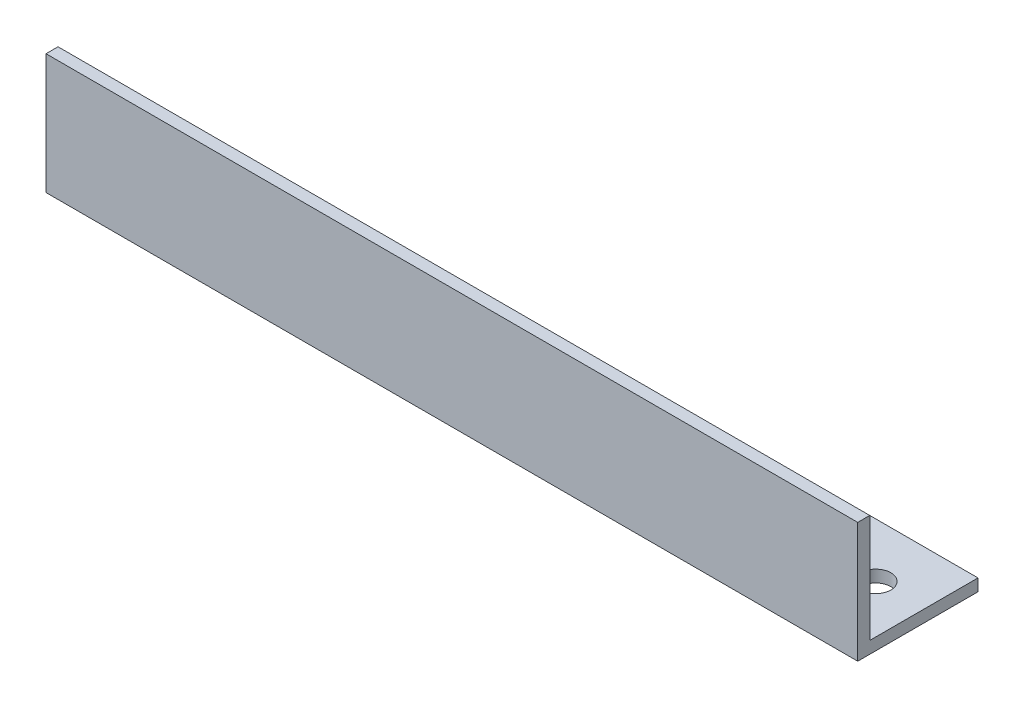
ISO-10303-21;
HEADER;
FILE_DESCRIPTION(('STEP AP214'),'2;1');
FILE_NAME('part.step','',(''),(''),'','','');
FILE_SCHEMA(('AUTOMOTIVE_DESIGN { 1 0 10303 214 1 1 1 1 }'));
ENDSEC;
DATA;
#1=APPLICATION_CONTEXT('core data for automotive mechanical design processes');
#2=APPLICATION_PROTOCOL_DEFINITION('international standard','automotive_design',2000,#1);
#3=PRODUCT_CONTEXT('',#1,'mechanical');
#4=PRODUCT('Part','Part','',(#3));
#5=PRODUCT_RELATED_PRODUCT_CATEGORY('part','',(#4));
#6=PRODUCT_DEFINITION_FORMATION('','',#4);
#7=PRODUCT_DEFINITION_CONTEXT('part definition',#1,'design');
#8=PRODUCT_DEFINITION('design','',#6,#7);
#9=PRODUCT_DEFINITION_SHAPE('','',#8);
#10=(LENGTH_UNIT() NAMED_UNIT(*) SI_UNIT(.MILLI.,.METRE.));
#11=(NAMED_UNIT(*) PLANE_ANGLE_UNIT() SI_UNIT($,.RADIAN.));
#12=(NAMED_UNIT(*) SI_UNIT($,.STERADIAN.) SOLID_ANGLE_UNIT());
#13=UNCERTAINTY_MEASURE_WITH_UNIT(LENGTH_MEASURE(1.E-05),#10,'distance_accuracy_value','');
#14=(GEOMETRIC_REPRESENTATION_CONTEXT(3) GLOBAL_UNCERTAINTY_ASSIGNED_CONTEXT((#13)) GLOBAL_UNIT_ASSIGNED_CONTEXT((#10,
#11,#12)) REPRESENTATION_CONTEXT('',''));
#15=CARTESIAN_POINT('',(0.,0.,0.));
#16=DIRECTION('',(0.,0.,1.));
#17=DIRECTION('',(1.,0.,0.));
#18=AXIS2_PLACEMENT_3D('',#15,#16,#17);
#19=CARTESIAN_POINT('',(-135.,20.,-2.));
#20=DIRECTION('',(0.,1.,0.));
#21=DIRECTION('',(0.,0.,1.));
#22=AXIS2_PLACEMENT_3D('',#19,#20,#21);
#23=PLANE('',#22);
#24=DIRECTION('',(0.,0.,1.));
#25=VECTOR('',#24,1.);
#26=CARTESIAN_POINT('',(0.,20.,-2.));
#27=LINE('',#26,#25);
#28=CARTESIAN_POINT('',(0.,20.,-2.));
#29=VERTEX_POINT('',#28);
#30=CARTESIAN_POINT('',(0.,20.,0.));
#31=VERTEX_POINT('',#30);
#32=EDGE_CURVE('E128',#29,#31,#27,.T.);
#33=ORIENTED_EDGE('',*,*,#32,.F.);
#34=DIRECTION('',(1.,0.,0.));
#35=VECTOR('',#34,1.);
#36=CARTESIAN_POINT('',(-135.,20.,-2.));
#37=LINE('',#36,#35);
#38=CARTESIAN_POINT('',(-135.,20.,-2.));
#39=VERTEX_POINT('',#38);
#40=EDGE_CURVE('E11',#39,#29,#37,.T.);
#41=ORIENTED_EDGE('',*,*,#40,.F.);
#42=DIRECTION('',(0.,0.,1.));
#43=VECTOR('',#42,1.);
#44=CARTESIAN_POINT('',(-135.,20.,-2.));
#45=LINE('',#44,#43);
#46=CARTESIAN_POINT('',(-135.,20.,0.));
#47=VERTEX_POINT('',#46);
#48=EDGE_CURVE('E143',#39,#47,#45,.T.);
#49=ORIENTED_EDGE('',*,*,#48,.T.);
#50=DIRECTION('',(1.,0.,0.));
#51=VECTOR('',#50,1.);
#52=CARTESIAN_POINT('',(-135.,20.,0.));
#53=LINE('',#52,#51);
#54=EDGE_CURVE('E46',#47,#31,#53,.T.);
#55=ORIENTED_EDGE('',*,*,#54,.T.);
#56=EDGE_LOOP('',(#33,#41,#49,#55));
#57=FACE_BOUND('',#56,.T.);
#58=ADVANCED_FACE('F43',(#57),#23,.T.);
#59=CARTESIAN_POINT('',(-135.,2.,-2.));
#60=DIRECTION('',(0.,0.,-1.));
#61=DIRECTION('',(0.,1.,0.));
#62=AXIS2_PLACEMENT_3D('',#59,#60,#61);
#63=PLANE('',#62);
#64=DIRECTION('',(0.,1.,0.));
#65=VECTOR('',#64,1.);
#66=CARTESIAN_POINT('',(0.,2.,-2.));
#67=LINE('',#66,#65);
#68=CARTESIAN_POINT('',(0.,2.,-2.));
#69=VERTEX_POINT('',#68);
#70=EDGE_CURVE('E141',#69,#29,#67,.T.);
#71=ORIENTED_EDGE('',*,*,#70,.F.);
#72=DIRECTION('',(1.,0.,0.));
#73=VECTOR('',#72,1.);
#74=CARTESIAN_POINT('',(-135.,2.,-2.));
#75=LINE('',#74,#73);
#76=CARTESIAN_POINT('',(-135.,2.,-2.));
#77=VERTEX_POINT('',#76);
#78=EDGE_CURVE('E52',#77,#69,#75,.T.);
#79=ORIENTED_EDGE('',*,*,#78,.F.);
#80=DIRECTION('',(0.,1.,0.));
#81=VECTOR('',#80,1.);
#82=CARTESIAN_POINT('',(-135.,2.,-2.));
#83=LINE('',#82,#81);
#84=EDGE_CURVE('E118',#77,#39,#83,.T.);
#85=ORIENTED_EDGE('',*,*,#84,.T.);
#86=ORIENTED_EDGE('',*,*,#40,.T.);
#87=EDGE_LOOP('',(#71,#79,#85,#86));
#88=FACE_BOUND('',#87,.T.);
#89=ADVANCED_FACE('F151',(#88),#63,.T.);
#90=CARTESIAN_POINT('',(-135.,2.,-20.));
#91=DIRECTION('',(0.,1.,0.));
#92=DIRECTION('',(0.,0.,1.));
#93=AXIS2_PLACEMENT_3D('',#90,#91,#92);
#94=PLANE('',#93);
#95=CARTESIAN_POINT('',(-8.,2.,-11.));
#96=DIRECTION('',(0.,1.,0.));
#97=DIRECTION('',(0.,0.,1.));
#98=AXIS2_PLACEMENT_3D('',#95,#96,#97);
#99=CIRCLE('',#98,2.5);
#100=CARTESIAN_POINT('',(-8.,2.,-8.5));
#101=VERTEX_POINT('',#100);
#102=EDGE_CURVE('E190',#101,#101,#99,.T.);
#103=ORIENTED_EDGE('',*,*,#102,.F.);
#104=EDGE_LOOP('',(#103));
#105=FACE_BOUND('',#104,.T.);
#106=CARTESIAN_POINT('',(-30.,2.,-11.));
#107=DIRECTION('',(0.,1.,0.));
#108=DIRECTION('',(0.,0.,1.));
#109=AXIS2_PLACEMENT_3D('',#106,#107,#108);
#110=CIRCLE('',#109,2.5);
#111=CARTESIAN_POINT('',(-30.,2.,-8.5));
#112=VERTEX_POINT('',#111);
#113=EDGE_CURVE('E191',#112,#112,#110,.T.);
#114=ORIENTED_EDGE('',*,*,#113,.F.);
#115=EDGE_LOOP('',(#114));
#116=FACE_BOUND('',#115,.T.);
#117=DIRECTION('',(0.,0.,1.));
#118=VECTOR('',#117,1.);
#119=CARTESIAN_POINT('',(0.,2.,-20.));
#120=LINE('',#119,#118);
#121=CARTESIAN_POINT('',(0.,2.,-20.));
#122=VERTEX_POINT('',#121);
#123=EDGE_CURVE('E105',#122,#69,#120,.T.);
#124=ORIENTED_EDGE('',*,*,#123,.F.);
#125=DIRECTION('',(1.,0.,0.));
#126=VECTOR('',#125,1.);
#127=CARTESIAN_POINT('',(-135.,2.,-20.));
#128=LINE('',#127,#126);
#129=CARTESIAN_POINT('',(-135.,2.,-20.));
#130=VERTEX_POINT('',#129);
#131=EDGE_CURVE('E100',#130,#122,#128,.T.);
#132=ORIENTED_EDGE('',*,*,#131,.F.);
#133=DIRECTION('',(0.,0.,1.));
#134=VECTOR('',#133,1.);
#135=CARTESIAN_POINT('',(-135.,2.,-20.));
#136=LINE('',#135,#134);
#137=EDGE_CURVE('E103',#130,#77,#136,.T.);
#138=ORIENTED_EDGE('',*,*,#137,.T.);
#139=ORIENTED_EDGE('',*,*,#78,.T.);
#140=EDGE_LOOP('',(#124,#132,#138,#139));
#141=FACE_BOUND('',#140,.T.);
#142=ADVANCED_FACE('F102',(#105,#116,#141),#94,.T.);
#143=CARTESIAN_POINT('',(-135.,0.,-20.));
#144=DIRECTION('',(0.,0.,-1.));
#145=DIRECTION('',(-1.,0.,0.));
#146=AXIS2_PLACEMENT_3D('',#143,#144,#145);
#147=PLANE('',#146);
#148=DIRECTION('',(0.,1.,0.));
#149=VECTOR('',#148,1.);
#150=CARTESIAN_POINT('',(0.,0.,-20.));
#151=LINE('',#150,#149);
#152=CARTESIAN_POINT('',(0.,0.,-20.));
#153=VERTEX_POINT('',#152);
#154=EDGE_CURVE('E138',#153,#122,#151,.T.);
#155=ORIENTED_EDGE('',*,*,#154,.F.);
#156=DIRECTION('',(1.,0.,0.));
#157=VECTOR('',#156,1.);
#158=CARTESIAN_POINT('',(-135.,0.,-20.));
#159=LINE('',#158,#157);
#160=CARTESIAN_POINT('',(-135.,0.,-20.));
#161=VERTEX_POINT('',#160);
#162=EDGE_CURVE('E110',#161,#153,#159,.T.);
#163=ORIENTED_EDGE('',*,*,#162,.F.);
#164=DIRECTION('',(0.,1.,0.));
#165=VECTOR('',#164,1.);
#166=CARTESIAN_POINT('',(-135.,0.,-20.));
#167=LINE('',#166,#165);
#168=EDGE_CURVE('E116',#161,#130,#167,.T.);
#169=ORIENTED_EDGE('',*,*,#168,.T.);
#170=ORIENTED_EDGE('',*,*,#131,.T.);
#171=EDGE_LOOP('',(#155,#163,#169,#170));
#172=FACE_BOUND('',#171,.T.);
#173=ADVANCED_FACE('F120',(#172),#147,.T.);
#174=CARTESIAN_POINT('',(-135.,0.,0.));
#175=DIRECTION('',(0.,-1.,0.));
#176=DIRECTION('',(0.,0.,-1.));
#177=AXIS2_PLACEMENT_3D('',#174,#175,#176);
#178=PLANE('',#177);
#179=CARTESIAN_POINT('',(-8.,0.,-11.));
#180=DIRECTION('',(0.,1.,0.));
#181=DIRECTION('',(0.,0.,1.));
#182=AXIS2_PLACEMENT_3D('',#179,#180,#181);
#183=CIRCLE('',#182,2.5);
#184=CARTESIAN_POINT('',(-8.,0.,-8.5));
#185=VERTEX_POINT('',#184);
#186=EDGE_CURVE('E132',#185,#185,#183,.T.);
#187=ORIENTED_EDGE('',*,*,#186,.T.);
#188=EDGE_LOOP('',(#187));
#189=FACE_BOUND('',#188,.T.);
#190=CARTESIAN_POINT('',(-30.,0.,-11.));
#191=DIRECTION('',(0.,1.,0.));
#192=DIRECTION('',(0.,0.,1.));
#193=AXIS2_PLACEMENT_3D('',#190,#191,#192);
#194=CIRCLE('',#193,2.5);
#195=CARTESIAN_POINT('',(-30.,0.,-8.5));
#196=VERTEX_POINT('',#195);
#197=EDGE_CURVE('E195',#196,#196,#194,.T.);
#198=ORIENTED_EDGE('',*,*,#197,.T.);
#199=EDGE_LOOP('',(#198));
#200=FACE_BOUND('',#199,.T.);
#201=DIRECTION('',(0.,0.,-1.));
#202=VECTOR('',#201,1.);
#203=CARTESIAN_POINT('',(0.,0.,0.));
#204=LINE('',#203,#202);
#205=CARTESIAN_POINT('',(0.,0.,0.));
#206=VERTEX_POINT('',#205);
#207=EDGE_CURVE('E135',#206,#153,#204,.T.);
#208=ORIENTED_EDGE('',*,*,#207,.F.);
#209=DIRECTION('',(1.,0.,0.));
#210=VECTOR('',#209,1.);
#211=CARTESIAN_POINT('',(-135.,0.,0.));
#212=LINE('',#211,#210);
#213=CARTESIAN_POINT('',(-135.,0.,0.));
#214=VERTEX_POINT('',#213);
#215=EDGE_CURVE('E146',#214,#206,#212,.T.);
#216=ORIENTED_EDGE('',*,*,#215,.F.);
#217=DIRECTION('',(0.,0.,-1.));
#218=VECTOR('',#217,1.);
#219=CARTESIAN_POINT('',(-135.,0.,0.));
#220=LINE('',#219,#218);
#221=EDGE_CURVE('E121',#214,#161,#220,.T.);
#222=ORIENTED_EDGE('',*,*,#221,.T.);
#223=ORIENTED_EDGE('',*,*,#162,.T.);
#224=EDGE_LOOP('',(#208,#216,#222,#223));
#225=FACE_BOUND('',#224,.T.);
#226=ADVANCED_FACE('F165',(#189,#200,#225),#178,.T.);
#227=CARTESIAN_POINT('',(-135.,20.,0.));
#228=DIRECTION('',(0.,0.,1.));
#229=DIRECTION('',(1.,0.,0.));
#230=AXIS2_PLACEMENT_3D('',#227,#228,#229);
#231=PLANE('',#230);
#232=DIRECTION('',(0.,-1.,0.));
#233=VECTOR('',#232,1.);
#234=CARTESIAN_POINT('',(0.,20.,0.));
#235=LINE('',#234,#233);
#236=EDGE_CURVE('E131',#31,#206,#235,.T.);
#237=ORIENTED_EDGE('',*,*,#236,.F.);
#238=ORIENTED_EDGE('',*,*,#54,.F.);
#239=DIRECTION('',(0.,-1.,0.));
#240=VECTOR('',#239,1.);
#241=CARTESIAN_POINT('',(-135.,20.,0.));
#242=LINE('',#241,#240);
#243=EDGE_CURVE('E123',#47,#214,#242,.T.);
#244=ORIENTED_EDGE('',*,*,#243,.T.);
#245=ORIENTED_EDGE('',*,*,#215,.T.);
#246=EDGE_LOOP('',(#237,#238,#244,#245));
#247=FACE_BOUND('',#246,.T.);
#248=ADVANCED_FACE('F148',(#247),#231,.T.);
#249=CARTESIAN_POINT('',(-135.,0.,0.));
#250=DIRECTION('',(1.,0.,0.));
#251=DIRECTION('',(0.,0.,-1.));
#252=AXIS2_PLACEMENT_3D('',#249,#250,#251);
#253=PLANE('',#252);
#254=ORIENTED_EDGE('',*,*,#48,.F.);
#255=ORIENTED_EDGE('',*,*,#84,.F.);
#256=ORIENTED_EDGE('',*,*,#137,.F.);
#257=ORIENTED_EDGE('',*,*,#168,.F.);
#258=ORIENTED_EDGE('',*,*,#221,.F.);
#259=ORIENTED_EDGE('',*,*,#243,.F.);
#260=EDGE_LOOP('',(#254,#255,#256,#257,#258,#259));
#261=FACE_BOUND('',#260,.T.);
#262=ADVANCED_FACE('F114',(#261),#253,.F.);
#263=CARTESIAN_POINT('',(0.,0.,0.));
#264=DIRECTION('',(1.,0.,0.));
#265=DIRECTION('',(0.,0.,-1.));
#266=AXIS2_PLACEMENT_3D('',#263,#264,#265);
#267=PLANE('',#266);
#268=ORIENTED_EDGE('',*,*,#32,.T.);
#269=ORIENTED_EDGE('',*,*,#236,.T.);
#270=ORIENTED_EDGE('',*,*,#207,.T.);
#271=ORIENTED_EDGE('',*,*,#154,.T.);
#272=ORIENTED_EDGE('',*,*,#123,.T.);
#273=ORIENTED_EDGE('',*,*,#70,.T.);
#274=EDGE_LOOP('',(#268,#269,#270,#271,#272,#273));
#275=FACE_BOUND('',#274,.T.);
#276=ADVANCED_FACE('F150',(#275),#267,.T.);
#277=CARTESIAN_POINT('',(-30.,0.,-11.));
#278=DIRECTION('',(0.,1.,0.));
#279=DIRECTION('',(0.,0.,1.));
#280=AXIS2_PLACEMENT_3D('',#277,#278,#279);
#281=CYLINDRICAL_SURFACE('',#280,2.5);
#282=ORIENTED_EDGE('',*,*,#197,.F.);
#283=EDGE_LOOP('',(#282));
#284=FACE_BOUND('',#283,.T.);
#285=ORIENTED_EDGE('',*,*,#113,.T.);
#286=EDGE_LOOP('',(#285));
#287=FACE_BOUND('',#286,.T.);
#288=ADVANCED_FACE('F175',(#284,#287),#281,.F.);
#289=CARTESIAN_POINT('',(-8.,0.,-11.));
#290=DIRECTION('',(0.,1.,0.));
#291=DIRECTION('',(0.,0.,1.));
#292=AXIS2_PLACEMENT_3D('',#289,#290,#291);
#293=CYLINDRICAL_SURFACE('',#292,2.5);
#294=ORIENTED_EDGE('',*,*,#186,.F.);
#295=EDGE_LOOP('',(#294));
#296=FACE_BOUND('',#295,.T.);
#297=ORIENTED_EDGE('',*,*,#102,.T.);
#298=EDGE_LOOP('',(#297));
#299=FACE_BOUND('',#298,.T.);
#300=ADVANCED_FACE('F179',(#296,#299),#293,.F.);
#301=CLOSED_SHELL('',(#58,#89,#142,#173,#226,#248,#262,#276,#288,#300));
#302=MANIFOLD_SOLID_BREP('B2',#301);
#303=ADVANCED_BREP_SHAPE_REPRESENTATION('',(#18,#302),#14);
#304=SHAPE_DEFINITION_REPRESENTATION(#9,#303);
ENDSEC;
END-ISO-10303-21;
